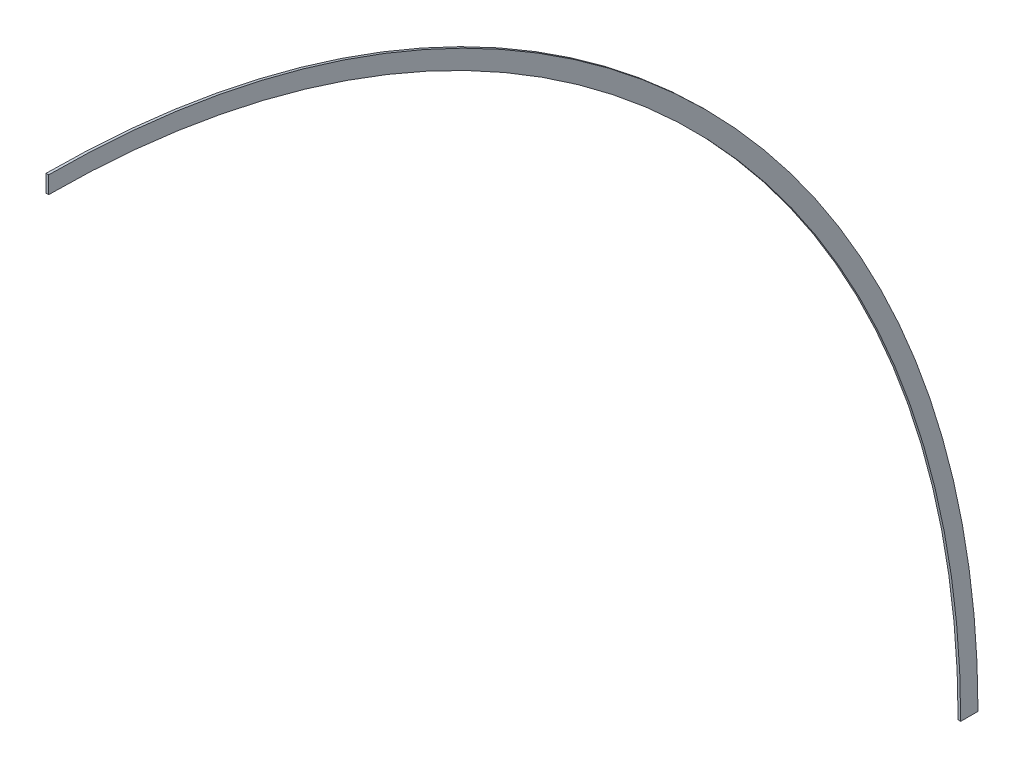
ISO-10303-21;
HEADER;
FILE_DESCRIPTION(('STEP AP214'),'2;1');
FILE_NAME('part.step','',(''),(''),'','','');
FILE_SCHEMA(('AUTOMOTIVE_DESIGN { 1 0 10303 214 1 1 1 1 }'));
ENDSEC;
DATA;
#1=APPLICATION_CONTEXT('core data for automotive mechanical design processes');
#2=APPLICATION_PROTOCOL_DEFINITION('international standard','automotive_design',2000,#1);
#3=PRODUCT_CONTEXT('',#1,'mechanical');
#4=PRODUCT('Part','Part','',(#3));
#5=PRODUCT_RELATED_PRODUCT_CATEGORY('part','',(#4));
#6=PRODUCT_DEFINITION_FORMATION('','',#4);
#7=PRODUCT_DEFINITION_CONTEXT('part definition',#1,'design');
#8=PRODUCT_DEFINITION('design','',#6,#7);
#9=PRODUCT_DEFINITION_SHAPE('','',#8);
#10=(LENGTH_UNIT() NAMED_UNIT(*) SI_UNIT(.MILLI.,.METRE.));
#11=(NAMED_UNIT(*) PLANE_ANGLE_UNIT() SI_UNIT($,.RADIAN.));
#12=(NAMED_UNIT(*) SI_UNIT($,.STERADIAN.) SOLID_ANGLE_UNIT());
#13=UNCERTAINTY_MEASURE_WITH_UNIT(LENGTH_MEASURE(1.E-05),#10,'distance_accuracy_value','');
#14=(GEOMETRIC_REPRESENTATION_CONTEXT(3) GLOBAL_UNCERTAINTY_ASSIGNED_CONTEXT((#13)) GLOBAL_UNIT_ASSIGNED_CONTEXT((#10,
#11,#12)) REPRESENTATION_CONTEXT('',''));
#15=CARTESIAN_POINT('',(0.,0.,0.));
#16=DIRECTION('',(0.,0.,1.));
#17=DIRECTION('',(1.,0.,0.));
#18=AXIS2_PLACEMENT_3D('',#15,#16,#17);
#19=CARTESIAN_POINT('',(3.,0.,0.));
#20=DIRECTION('',(-1.,0.,0.));
#21=DIRECTION('',(0.,0.,1.));
#22=AXIS2_PLACEMENT_3D('',#19,#20,#21);
#23=CYLINDRICAL_SURFACE('',#22,1057.);
#24=CARTESIAN_POINT('',(0.,0.,0.));
#25=DIRECTION('',(-1.,0.,0.));
#26=DIRECTION('',(0.,0.,-1.));
#27=AXIS2_PLACEMENT_3D('',#24,#25,#26);
#28=CIRCLE('',#27,1057.);
#29=CARTESIAN_POINT('',(0.,1057.,-1.97590017824063E-13));
#30=VERTEX_POINT('',#29);
#31=CARTESIAN_POINT('',(0.,0.,-1057.));
#32=VERTEX_POINT('',#31);
#33=EDGE_CURVE('E97',#30,#32,#28,.T.);
#34=ORIENTED_EDGE('',*,*,#33,.T.);
#35=DIRECTION('',(-1.,0.,0.));
#36=VECTOR('',#35,1.);
#37=CARTESIAN_POINT('',(3.,0.,-1057.));
#38=LINE('',#37,#36);
#39=CARTESIAN_POINT('',(3.,0.,-1057.));
#40=VERTEX_POINT('',#39);
#41=EDGE_CURVE('E11',#40,#32,#38,.T.);
#42=ORIENTED_EDGE('',*,*,#41,.F.);
#43=CARTESIAN_POINT('',(3.,0.,0.));
#44=DIRECTION('',(-1.,0.,0.));
#45=DIRECTION('',(0.,0.,-1.));
#46=AXIS2_PLACEMENT_3D('',#43,#44,#45);
#47=CIRCLE('',#46,1057.);
#48=CARTESIAN_POINT('',(3.,1057.,-1.97590017824063E-13));
#49=VERTEX_POINT('',#48);
#50=EDGE_CURVE('E85',#49,#40,#47,.T.);
#51=ORIENTED_EDGE('',*,*,#50,.F.);
#52=DIRECTION('',(-1.,0.,0.));
#53=VECTOR('',#52,1.);
#54=CARTESIAN_POINT('',(3.,1057.,-1.97590017824063E-13));
#55=LINE('',#54,#53);
#56=EDGE_CURVE('E93',#49,#30,#55,.T.);
#57=ORIENTED_EDGE('',*,*,#56,.T.);
#58=EDGE_LOOP('',(#34,#42,#51,#57));
#59=FACE_BOUND('',#58,.T.);
#60=ADVANCED_FACE('F34',(#59),#23,.F.);
#61=CARTESIAN_POINT('',(3.,0.,-1057.));
#62=DIRECTION('',(0.,1.,0.));
#63=DIRECTION('',(0.,0.,1.));
#64=AXIS2_PLACEMENT_3D('',#61,#62,#63);
#65=PLANE('',#64);
#66=DIRECTION('',(0.,0.,-1.));
#67=VECTOR('',#66,1.);
#68=CARTESIAN_POINT('',(0.,0.,-1057.));
#69=LINE('',#68,#67);
#70=CARTESIAN_POINT('',(0.,0.,-1077.));
#71=VERTEX_POINT('',#70);
#72=EDGE_CURVE('E89',#32,#71,#69,.T.);
#73=ORIENTED_EDGE('',*,*,#72,.T.);
#74=DIRECTION('',(-1.,0.,0.));
#75=VECTOR('',#74,1.);
#76=CARTESIAN_POINT('',(3.,0.,-1077.));
#77=LINE('',#76,#75);
#78=CARTESIAN_POINT('',(3.,0.,-1077.));
#79=VERTEX_POINT('',#78);
#80=EDGE_CURVE('E42',#79,#71,#77,.T.);
#81=ORIENTED_EDGE('',*,*,#80,.F.);
#82=DIRECTION('',(0.,0.,-1.));
#83=VECTOR('',#82,1.);
#84=CARTESIAN_POINT('',(3.,0.,-1057.));
#85=LINE('',#84,#83);
#86=EDGE_CURVE('E80',#40,#79,#85,.T.);
#87=ORIENTED_EDGE('',*,*,#86,.F.);
#88=ORIENTED_EDGE('',*,*,#41,.T.);
#89=EDGE_LOOP('',(#73,#81,#87,#88));
#90=FACE_BOUND('',#89,.T.);
#91=ADVANCED_FACE('F88',(#90),#65,.F.);
#92=CARTESIAN_POINT('',(3.,0.,0.));
#93=DIRECTION('',(-1.,0.,0.));
#94=DIRECTION('',(0.,0.,1.));
#95=AXIS2_PLACEMENT_3D('',#92,#93,#94);
#96=CYLINDRICAL_SURFACE('',#95,1077.);
#97=CARTESIAN_POINT('',(0.,0.,0.));
#98=DIRECTION('',(1.,0.,0.));
#99=DIRECTION('',(0.,0.,-1.));
#100=AXIS2_PLACEMENT_3D('',#97,#98,#99);
#101=CIRCLE('',#100,1077.);
#102=CARTESIAN_POINT('',(0.,1077.,-2.53101169055321E-13));
#103=VERTEX_POINT('',#102);
#104=EDGE_CURVE('E67',#71,#103,#101,.T.);
#105=ORIENTED_EDGE('',*,*,#104,.T.);
#106=DIRECTION('',(-1.,0.,0.));
#107=VECTOR('',#106,1.);
#108=CARTESIAN_POINT('',(3.,1077.,-2.53101169055321E-13));
#109=LINE('',#108,#107);
#110=CARTESIAN_POINT('',(3.,1077.,-2.53101169055321E-13));
#111=VERTEX_POINT('',#110);
#112=EDGE_CURVE('E90',#111,#103,#109,.T.);
#113=ORIENTED_EDGE('',*,*,#112,.F.);
#114=CARTESIAN_POINT('',(3.,0.,0.));
#115=DIRECTION('',(1.,0.,0.));
#116=DIRECTION('',(0.,0.,-1.));
#117=AXIS2_PLACEMENT_3D('',#114,#115,#116);
#118=CIRCLE('',#117,1077.);
#119=EDGE_CURVE('E83',#79,#111,#118,.T.);
#120=ORIENTED_EDGE('',*,*,#119,.F.);
#121=ORIENTED_EDGE('',*,*,#80,.T.);
#122=EDGE_LOOP('',(#105,#113,#120,#121));
#123=FACE_BOUND('',#122,.T.);
#124=ADVANCED_FACE('F91',(#123),#96,.T.);
#125=CARTESIAN_POINT('',(3.,1057.,-1.97590017824063E-13));
#126=DIRECTION('',(0.,0.,-1.));
#127=DIRECTION('',(-1.,0.,0.));
#128=AXIS2_PLACEMENT_3D('',#125,#126,#127);
#129=PLANE('',#128);
#130=DIRECTION('',(0.,-1.,0.));
#131=VECTOR('',#130,1.);
#132=CARTESIAN_POINT('',(0.,1057.,-1.97590017824063E-13));
#133=LINE('',#132,#131);
#134=EDGE_CURVE('E73',#103,#30,#133,.T.);
#135=ORIENTED_EDGE('',*,*,#134,.T.);
#136=ORIENTED_EDGE('',*,*,#56,.F.);
#137=DIRECTION('',(0.,-1.,0.));
#138=VECTOR('',#137,1.);
#139=CARTESIAN_POINT('',(3.,1057.,-1.97590017824063E-13));
#140=LINE('',#139,#138);
#141=EDGE_CURVE('E50',#111,#49,#140,.T.);
#142=ORIENTED_EDGE('',*,*,#141,.F.);
#143=ORIENTED_EDGE('',*,*,#112,.T.);
#144=EDGE_LOOP('',(#135,#136,#142,#143));
#145=FACE_BOUND('',#144,.T.);
#146=ADVANCED_FACE('F104',(#145),#129,.F.);
#147=CARTESIAN_POINT('',(3.,0.,0.));
#148=DIRECTION('',(1.,0.,0.));
#149=DIRECTION('',(0.,0.,-1.));
#150=AXIS2_PLACEMENT_3D('',#147,#148,#149);
#151=PLANE('',#150);
#152=ORIENTED_EDGE('',*,*,#50,.T.);
#153=ORIENTED_EDGE('',*,*,#86,.T.);
#154=ORIENTED_EDGE('',*,*,#119,.T.);
#155=ORIENTED_EDGE('',*,*,#141,.T.);
#156=EDGE_LOOP('',(#152,#153,#154,#155));
#157=FACE_BOUND('',#156,.T.);
#158=ADVANCED_FACE('F81',(#157),#151,.T.);
#159=CARTESIAN_POINT('',(0.,0.,0.));
#160=DIRECTION('',(1.,0.,0.));
#161=DIRECTION('',(0.,0.,-1.));
#162=AXIS2_PLACEMENT_3D('',#159,#160,#161);
#163=PLANE('',#162);
#164=ORIENTED_EDGE('',*,*,#33,.F.);
#165=ORIENTED_EDGE('',*,*,#134,.F.);
#166=ORIENTED_EDGE('',*,*,#104,.F.);
#167=ORIENTED_EDGE('',*,*,#72,.F.);
#168=EDGE_LOOP('',(#164,#165,#166,#167));
#169=FACE_BOUND('',#168,.T.);
#170=ADVANCED_FACE('F107',(#169),#163,.F.);
#171=CLOSED_SHELL('',(#60,#91,#124,#146,#158,#170));
#172=MANIFOLD_SOLID_BREP('B2',#171);
#173=ADVANCED_BREP_SHAPE_REPRESENTATION('',(#18,#172),#14);
#174=SHAPE_DEFINITION_REPRESENTATION(#9,#173);
ENDSEC;
END-ISO-10303-21;
